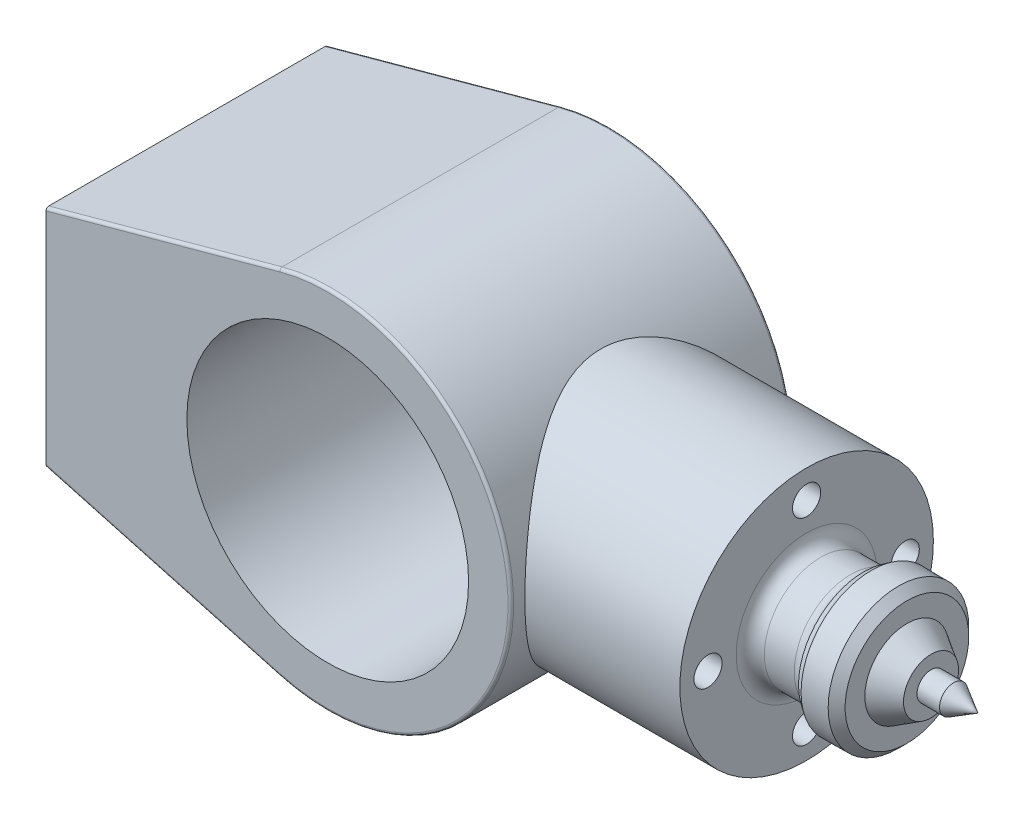
ISO-10303-21;
HEADER;
FILE_DESCRIPTION(('STEP AP214'),'2;1');
FILE_NAME('part.step','',(''),(''),'','','');
FILE_SCHEMA(('AUTOMOTIVE_DESIGN { 1 0 10303 214 1 1 1 1 }'));
ENDSEC;
DATA;
#1=APPLICATION_CONTEXT('core data for automotive mechanical design processes');
#2=APPLICATION_PROTOCOL_DEFINITION('international standard','automotive_design',2000,#1);
#3=PRODUCT_CONTEXT('',#1,'mechanical');
#4=PRODUCT('Part','Part','',(#3));
#5=PRODUCT_RELATED_PRODUCT_CATEGORY('part','',(#4));
#6=PRODUCT_DEFINITION_FORMATION('','',#4);
#7=PRODUCT_DEFINITION_CONTEXT('part definition',#1,'design');
#8=PRODUCT_DEFINITION('design','',#6,#7);
#9=PRODUCT_DEFINITION_SHAPE('','',#8);
#10=(LENGTH_UNIT() NAMED_UNIT(*) SI_UNIT(.MILLI.,.METRE.));
#11=(NAMED_UNIT(*) PLANE_ANGLE_UNIT() SI_UNIT($,.RADIAN.));
#12=(NAMED_UNIT(*) SI_UNIT($,.STERADIAN.) SOLID_ANGLE_UNIT());
#13=UNCERTAINTY_MEASURE_WITH_UNIT(LENGTH_MEASURE(1.E-05),#10,'distance_accuracy_value','');
#14=(GEOMETRIC_REPRESENTATION_CONTEXT(3) GLOBAL_UNCERTAINTY_ASSIGNED_CONTEXT((#13)) GLOBAL_UNIT_ASSIGNED_CONTEXT((#10,
#11,#12)) REPRESENTATION_CONTEXT('',''));
#15=CARTESIAN_POINT('',(0.,0.,0.));
#16=DIRECTION('',(0.,0.,1.));
#17=DIRECTION('',(1.,0.,0.));
#18=AXIS2_PLACEMENT_3D('',#15,#16,#17);
#19=CARTESIAN_POINT('',(0.,0.,50.));
#20=DIRECTION('',(0.,0.,1.));
#21=DIRECTION('',(1.,0.,0.));
#22=AXIS2_PLACEMENT_3D('',#19,#20,#21);
#23=PLANE('',#22);
#24=DIRECTION('',(0.,-1.,0.));
#25=VECTOR('',#24,1.);
#26=CARTESIAN_POINT('',(-100.,40.,50.));
#27=LINE('',#26,#25);
#28=CARTESIAN_POINT('',(-100.,38.9631546288037,50.));
#29=VERTEX_POINT('',#28);
#30=CARTESIAN_POINT('',(-100.,-38.9631546288037,50.));
#31=VERTEX_POINT('',#30);
#32=EDGE_CURVE('E340',#29,#31,#27,.T.);
#33=ORIENTED_EDGE('',*,*,#32,.T.);
#34=DIRECTION('',(0.964463967125762,-0.264214413149695,0.));
#35=VECTOR('',#34,1.);
#36=CARTESIAN_POINT('',(-16.9097224415805,-61.7256938960487,50.));
#37=LINE('',#36,#35);
#38=CARTESIAN_POINT('',(-16.9097224415805,-61.7256938960488,50.));
#39=VERTEX_POINT('',#38);
#40=EDGE_CURVE('E294',#31,#39,#37,.T.);
#41=ORIENTED_EDGE('',*,*,#40,.T.);
#42=CARTESIAN_POINT('',(0.,0.,50.));
#43=DIRECTION('',(0.,0.,1.));
#44=DIRECTION('',(1.,0.,0.));
#45=AXIS2_PLACEMENT_3D('',#42,#43,#44);
#46=CIRCLE('',#45,64.);
#47=CARTESIAN_POINT('',(-16.9097224415805,61.7256938960487,50.));
#48=VERTEX_POINT('',#47);
#49=EDGE_CURVE('E56',#39,#48,#46,.T.);
#50=ORIENTED_EDGE('',*,*,#49,.T.);
#51=DIRECTION('',(-0.964463967125762,-0.264214413149695,0.));
#52=VECTOR('',#51,1.);
#53=CARTESIAN_POINT('',(-99.7357855868503,39.0355360328742,50.));
#54=LINE('',#53,#52);
#55=EDGE_CURVE('E297',#48,#29,#54,.T.);
#56=ORIENTED_EDGE('',*,*,#55,.T.);
#57=EDGE_LOOP('',(#33,#41,#50,#56));
#58=FACE_BOUND('',#57,.T.);
#59=CARTESIAN_POINT('',(0.,0.,50.));
#60=DIRECTION('',(0.,0.,1.));
#61=DIRECTION('',(1.,0.,0.));
#62=AXIS2_PLACEMENT_3D('',#59,#60,#61);
#63=CIRCLE('',#62,50.);
#64=CARTESIAN_POINT('',(50.,0.,50.));
#65=VERTEX_POINT('',#64);
#66=EDGE_CURVE('E131',#65,#65,#63,.T.);
#67=ORIENTED_EDGE('',*,*,#66,.F.);
#68=EDGE_LOOP('',(#67));
#69=FACE_BOUND('',#68,.T.);
#70=ADVANCED_FACE('F34',(#58,#69),#23,.T.);
#71=CARTESIAN_POINT('',(0.,0.,-50.));
#72=DIRECTION('',(0.,0.,1.));
#73=DIRECTION('',(1.,0.,0.));
#74=AXIS2_PLACEMENT_3D('',#71,#72,#73);
#75=PLANE('',#74);
#76=CARTESIAN_POINT('',(0.,0.,-50.));
#77=DIRECTION('',(0.,0.,1.));
#78=DIRECTION('',(1.,0.,0.));
#79=AXIS2_PLACEMENT_3D('',#76,#77,#78);
#80=CIRCLE('',#79,64.);
#81=CARTESIAN_POINT('',(-16.9097224415805,61.7256938960487,-50.));
#82=VERTEX_POINT('',#81);
#83=CARTESIAN_POINT('',(-16.9097224415805,-61.7256938960488,-50.));
#84=VERTEX_POINT('',#83);
#85=EDGE_CURVE('E313',#82,#84,#80,.F.);
#86=ORIENTED_EDGE('',*,*,#85,.T.);
#87=DIRECTION('',(0.964463967125762,-0.264214413149695,0.));
#88=VECTOR('',#87,1.);
#89=CARTESIAN_POINT('',(-16.9097224415805,-61.7256938960487,-50.));
#90=LINE('',#89,#88);
#91=CARTESIAN_POINT('',(-100.,-38.9631546288037,-50.));
#92=VERTEX_POINT('',#91);
#93=EDGE_CURVE('E311',#84,#92,#90,.F.);
#94=ORIENTED_EDGE('',*,*,#93,.T.);
#95=DIRECTION('',(0.,-1.,0.));
#96=VECTOR('',#95,1.);
#97=CARTESIAN_POINT('',(-100.,40.,-50.));
#98=LINE('',#97,#96);
#99=CARTESIAN_POINT('',(-100.,38.9631546288037,-50.));
#100=VERTEX_POINT('',#99);
#101=EDGE_CURVE('E341',#100,#92,#98,.T.);
#102=ORIENTED_EDGE('',*,*,#101,.F.);
#103=DIRECTION('',(-0.964463967125762,-0.264214413149695,0.));
#104=VECTOR('',#103,1.);
#105=CARTESIAN_POINT('',(-16.9097224415805,61.7256938960487,-50.));
#106=LINE('',#105,#104);
#107=EDGE_CURVE('E315',#100,#82,#106,.F.);
#108=ORIENTED_EDGE('',*,*,#107,.T.);
#109=EDGE_LOOP('',(#86,#94,#102,#108));
#110=FACE_BOUND('',#109,.T.);
#111=CARTESIAN_POINT('',(0.,0.,-50.));
#112=DIRECTION('',(0.,0.,1.));
#113=DIRECTION('',(1.,0.,0.));
#114=AXIS2_PLACEMENT_3D('',#111,#112,#113);
#115=CIRCLE('',#114,50.);
#116=CARTESIAN_POINT('',(50.,0.,-50.));
#117=VERTEX_POINT('',#116);
#118=EDGE_CURVE('E124',#117,#117,#115,.T.);
#119=ORIENTED_EDGE('',*,*,#118,.T.);
#120=EDGE_LOOP('',(#119));
#121=FACE_BOUND('',#120,.T.);
#122=ADVANCED_FACE('F201',(#110,#121),#75,.F.);
#123=CARTESIAN_POINT('',(0.,0.,50.));
#124=DIRECTION('',(0.,0.,-1.));
#125=DIRECTION('',(-1.,0.,0.));
#126=AXIS2_PLACEMENT_3D('',#123,#124,#125);
#127=CYLINDRICAL_SURFACE('',#126,65.);
#128=CARTESIAN_POINT('',(65.,0.,-45.));
#129=CARTESIAN_POINT('',(65.0000011696057,1.12147330120565,-45.0000012025283));
#130=CARTESIAN_POINT('',(64.9709159765212,2.24292945230778,-44.9580201602482));
#131=CARTESIAN_POINT('',(64.8553068641383,4.47658414079082,-44.790785609369));
#132=CARTESIAN_POINT('',(64.7687842573088,5.58878288911931,-44.6655340035371));
#133=CARTESIAN_POINT('',(64.5403785763001,7.79555151848628,-44.3336771879691));
#134=CARTESIAN_POINT('',(64.3984760503456,8.89011506447751,-44.1270433931238));
#135=CARTESIAN_POINT('',(64.0626457436966,11.0533096019768,-43.6354760134034));
#136=CARTESIAN_POINT('',(63.8687169569864,12.1219400915896,-43.3505409144375));
#137=CARTESIAN_POINT('',(63.4342222744662,14.2212125160505,-42.7078017297046));
#138=CARTESIAN_POINT('',(63.1938918545645,15.2520162370063,-42.3503651251477));
#139=CARTESIAN_POINT('',(62.6709259446924,17.2756280115286,-41.5659763086892));
#140=CARTESIAN_POINT('',(62.3882907364915,18.268436318107,-41.1390245597888));
#141=CARTESIAN_POINT('',(61.786108553932,20.2116697228795,-40.2199419970838));
#142=CARTESIAN_POINT('',(61.4665619062631,21.1620951960855,-39.7278117601444));
#143=CARTESIAN_POINT('',(60.7962171584065,23.0172309124314,-38.6825647509799));
#144=CARTESIAN_POINT('',(60.4454175300334,23.9219389167185,-38.1294449962195));
#145=CARTESIAN_POINT('',(59.6865648974474,25.7601880140228,-36.9151737617935));
#146=CARTESIAN_POINT('',(59.27618815402,26.6893215363404,-36.2488040005491));
#147=CARTESIAN_POINT('',(58.4330275057249,28.4880338622967,-34.8529502059224));
#148=CARTESIAN_POINT('',(58.0002425478181,29.3576098626539,-34.1234632053608));
#149=CARTESIAN_POINT('',(57.1195111836477,31.0364486388513,-32.6040251352403));
#150=CARTESIAN_POINT('',(56.6715447181891,31.8456267033451,-31.8139921794123));
#151=CARTESIAN_POINT('',(55.7691986061138,33.4006700551814,-30.1773036556993));
#152=CARTESIAN_POINT('',(55.3148185876119,34.1465316534289,-29.3306447936721));
#153=CARTESIAN_POINT('',(54.3303114345595,35.6959084068904,-27.4326466159468));
#154=CARTESIAN_POINT('',(53.8005937511269,36.4872853280241,-26.3711450656527));
#155=CARTESIAN_POINT('',(52.7593327891933,37.9773509509911,-24.17604025639));
#156=CARTESIAN_POINT('',(52.2477941160227,38.6760162868262,-23.0424189272517));
#157=CARTESIAN_POINT('',(51.2608149265043,39.9749077721744,-20.7072341856928));
#158=CARTESIAN_POINT('',(50.7853275075273,40.5752630453964,-19.5057627267967));
#159=CARTESIAN_POINT('',(49.8892399163793,41.6721166930025,-17.036931864064));
#160=CARTESIAN_POINT('',(49.4686114171658,42.1686687478853,-15.7696069409943));
#161=CARTESIAN_POINT('',(48.8208029416879,42.9149535309565,-13.5723996352816));
#162=CARTESIAN_POINT('',(48.5738420263557,43.1936925213245,-12.6581208440976));
#163=CARTESIAN_POINT('',(48.1238801744123,43.6944569649788,-10.8035389223551));
#164=CARTESIAN_POINT('',(47.9208721021929,43.9164916250901,-9.86324004407419));
#165=CARTESIAN_POINT('',(47.5660754926548,44.3005296261305,-7.96250438663409));
#166=CARTESIAN_POINT('',(47.4142038087044,44.4626304606427,-7.00210302149487));
#167=CARTESIAN_POINT('',(47.1671263845177,44.7246555122386,-5.06554052628518));
#168=CARTESIAN_POINT('',(47.0719206259529,44.824579749433,-4.08937940131224));
#169=CARTESIAN_POINT('',(46.9418899090943,44.9607388198673,-2.1232364847967));
#170=CARTESIAN_POINT('',(46.9073939345417,44.9966266570423,-1.13320851844658));
#171=CARTESIAN_POINT('',(46.9013571135476,45.0029190462422,0.847248377093852));
#172=CARTESIAN_POINT('',(46.9298161498631,44.9733237202183,1.837677305534));
#173=CARTESIAN_POINT('',(47.0484302849821,44.8492190899201,3.81128752429081));
#174=CARTESIAN_POINT('',(47.13862305521,44.7546701492421,4.79446401850661));
#175=CARTESIAN_POINT('',(47.3768313176079,44.5024241630868,6.74551496467455));
#176=CARTESIAN_POINT('',(47.5248480621437,44.3447257499009,7.71338908473168));
#177=CARTESIAN_POINT('',(47.8621764271841,43.9803320764262,9.56919366964684));
#178=CARTESIAN_POINT('',(48.0484149088864,43.7772163066585,10.4583970625519));
#179=CARTESIAN_POINT('',(48.4609441046406,43.32010640119,12.2144143492181));
#180=CARTESIAN_POINT('',(48.6872496045115,43.0660934784815,13.0812198417583));
#181=CARTESIAN_POINT('',(49.1738509640383,42.5096331932465,14.7898225666927));
#182=CARTESIAN_POINT('',(49.4341648638834,42.2071601049958,15.6316062329481));
#183=CARTESIAN_POINT('',(49.9825182796335,41.5563350032134,17.2876417419013));
#184=CARTESIAN_POINT('',(50.2705534011697,41.2079902580444,18.1018979206949));
#185=CARTESIAN_POINT('',(51.0225431471345,40.2767822129268,20.1137766396802));
#186=CARTESIAN_POINT('',(51.5007434523328,39.6654891440572,21.2930273345177));
#187=CARTESIAN_POINT('',(52.4891158781477,38.348029920852,23.5833678403921));
#188=CARTESIAN_POINT('',(52.9993005340589,37.6418264436726,24.6944305853524));
#189=CARTESIAN_POINT('',(54.0361557973494,36.1376496350166,26.8476775780095));
#190=CARTESIAN_POINT('',(54.5628535785461,35.3395185623559,27.8897384505711));
#191=CARTESIAN_POINT('',(55.6171804467178,33.6558443419671,29.8998791095632));
#192=CARTESIAN_POINT('',(56.1448094104418,32.7703120184234,30.8679680307498));
#193=CARTESIAN_POINT('',(57.1932449701135,30.9045304086319,32.7363921475659));
#194=CARTESIAN_POINT('',(57.7139191350983,29.9233731295192,33.6358963165067));
#195=CARTESIAN_POINT('',(58.7296419536465,27.8771206485979,35.350355349792));
#196=CARTESIAN_POINT('',(59.2246882700661,26.8120178135979,36.1653025097018));
#197=CARTESIAN_POINT('',(60.1756566955639,24.6035209522421,37.7024332048813));
#198=CARTESIAN_POINT('',(60.6316475651595,23.4602711709794,38.4247809320632));
#199=CARTESIAN_POINT('',(61.4931891608211,21.0989507187335,39.7703323765769));
#200=CARTESIAN_POINT('',(61.898755017873,19.8809026570889,40.3935658507715));
#201=CARTESIAN_POINT('',(62.5646802947783,17.6549035875762,41.4059204565395));
#202=CARTESIAN_POINT('',(62.8372982548467,16.6602403417733,41.8163120535009));
#203=CARTESIAN_POINT('',(63.3397164077328,14.6345031625144,42.5675669112335));
#204=CARTESIAN_POINT('',(63.569522535998,13.603434299959,42.9084398107234));
#205=CARTESIAN_POINT('',(63.9815049902596,11.5110112910016,43.5164676119118));
#206=CARTESIAN_POINT('',(64.1637052650743,10.4496726714621,43.7836595836378));
#207=CARTESIAN_POINT('',(64.476639865795,8.30296993183371,44.2409869387356));
#208=CARTESIAN_POINT('',(64.6073730982257,7.21760530180254,44.431120684921));
#209=CARTESIAN_POINT('',(64.8147345736682,5.02649787175023,44.7321113931983));
#210=CARTESIAN_POINT('',(64.8911534961694,3.92069290489763,44.8426616714377));
#211=CARTESIAN_POINT('',(64.9872183357685,1.70145350776208,44.981563734156));
#212=CARTESIAN_POINT('',(65.0068642771874,0.588019080747696,45.0099155538474));
#213=CARTESIAN_POINT('',(64.9889001241945,-1.63741781931566,44.9839662509349));
#214=CARTESIAN_POINT('',(64.9512898349751,-2.74942028747967,44.929664847113));
#215=CARTESIAN_POINT('',(64.819734418053,-4.96298947367603,44.7392747901952));
#216=CARTESIAN_POINT('',(64.7257910494465,-6.06455651648127,44.6031886909653));
#217=CARTESIAN_POINT('',(64.491175703309,-8.18254449212149,44.2620157992034));
#218=CARTESIAN_POINT('',(64.3536808680178,-9.20007959997774,44.0616107864454));
#219=CARTESIAN_POINT('',(64.0337856060908,-11.2121337136589,43.5930613516679));
#220=CARTESIAN_POINT('',(63.8513873855499,-12.2066538475799,43.3249202574929));
#221=CARTESIAN_POINT('',(63.4451725249075,-14.1673074608523,42.7239854011605));
#222=CARTESIAN_POINT('',(63.2213525684632,-15.1334386601223,42.3911864622047));
#223=CARTESIAN_POINT('',(62.736336352677,-17.0327019487273,41.6643868113868));
#224=CARTESIAN_POINT('',(62.4751380044848,-17.965832190203,41.2703826790343));
#225=CARTESIAN_POINT('',(61.8990085085122,-19.8637431772395,40.3931275129008));
#226=CARTESIAN_POINT('',(61.5815209528501,-20.8256806929253,39.9054081529014));
#227=CARTESIAN_POINT('',(60.9142086391395,-22.7035764997345,38.8677076181211));
#228=CARTESIAN_POINT('',(60.5643826081083,-23.6195329786528,38.3177239921568));
#229=CARTESIAN_POINT('',(59.8381347129401,-25.4032558353403,37.1592008079418));
#230=CARTESIAN_POINT('',(59.4616987975441,-26.270996314329,36.5506302507532));
#231=CARTESIAN_POINT('',(58.6884577670336,-27.9557544991496,35.2787474176625));
#232=CARTESIAN_POINT('',(58.2916515549571,-28.7727694681138,34.6154321925309));
#233=CARTESIAN_POINT('',(57.4151711853793,-30.4889708749912,33.1199200847161));
#234=CARTESIAN_POINT('',(56.9328754552547,-31.3785212006928,32.2781812569548));
#235=CARTESIAN_POINT('',(55.9590893109094,-33.0839042215169,30.5278352445589));
#236=CARTESIAN_POINT('',(55.4675975421249,-33.8997259516808,29.6192181500899));
#237=CARTESIAN_POINT('',(54.4860350387397,-35.45586994741,27.7375714933993));
#238=CARTESIAN_POINT('',(53.9959654596117,-36.1961418986443,26.7644997080007));
#239=CARTESIAN_POINT('',(53.0294834997435,-37.5978502361011,24.7568233036382));
#240=CARTESIAN_POINT('',(52.553069328415,-38.2592969946585,23.7222268074148));
#241=CARTESIAN_POINT('',(51.679941347726,-39.4291013564639,21.7149007388747));
#242=CARTESIAN_POINT('',(51.2803372484816,-39.9463152685162,20.7485884228094));
#243=CARTESIAN_POINT('',(50.5123974548912,-40.9130636661729,18.7705314851885));
#244=CARTESIAN_POINT('',(50.1440619804653,-41.3625976757848,17.7587865441704));
#245=CARTESIAN_POINT('',(49.4504928922364,-42.1893301292689,15.693797265063));
#246=CARTESIAN_POINT('',(49.1251906412473,-42.566644202947,14.6406225749502));
#247=CARTESIAN_POINT('',(48.5290098021012,-43.2451098617227,12.4950157035289));
#248=CARTESIAN_POINT('',(48.2581179989952,-43.5462799449171,11.4025931307277));
#249=CARTESIAN_POINT('',(47.8271610412375,-44.0186874861181,9.3921629994351));
#250=CARTESIAN_POINT('',(47.6558419905218,-44.2036946073207,8.47979353570419));
#251=CARTESIAN_POINT('',(47.3627606953031,-44.517583244497,6.63757582668245));
#252=CARTESIAN_POINT('',(47.2409923142224,-44.6464717105955,5.70772976070373));
#253=CARTESIAN_POINT('',(47.05166615705,-44.8459556683364,3.83718735816971));
#254=CARTESIAN_POINT('',(46.9840561376509,-44.9166073394187,2.89650236820514));
#255=CARTESIAN_POINT('',(46.9055698265682,-44.9985645522097,1.01014116515035));
#256=CARTESIAN_POINT('',(46.894694331428,-45.0098692606967,0.0644648821697862));
#257=CARTESIAN_POINT('',(46.9301408777119,-44.972908524549,-1.82506201386804));
#258=CARTESIAN_POINT('',(46.9764888551696,-44.9246160680299,-2.76891160474201));
#259=CARTESIAN_POINT('',(47.1245232303033,-44.7693052695385,-4.64731891289862));
#260=CARTESIAN_POINT('',(47.226209296244,-44.6622872796082,-5.58187668584874));
#261=CARTESIAN_POINT('',(47.4811423262629,-44.3911660407895,-7.43666598606561));
#262=CARTESIAN_POINT('',(47.634452919394,-44.2269923369625,-8.35687836049678));
#263=CARTESIAN_POINT('',(47.9871889035597,-43.8440109221367,-10.1768310643423));
#264=CARTESIAN_POINT('',(48.1866204648689,-43.6251959006593,-11.0765686368372));
#265=CARTESIAN_POINT('',(48.6908782922366,-43.0625185245671,-13.116726178063));
#266=CARTESIAN_POINT('',(49.0093972350599,-42.7008255731353,-14.2488681052183));
#267=CARTESIAN_POINT('',(49.699554494161,-41.8955268796886,-16.4668795226373));
#268=CARTESIAN_POINT('',(50.0712093704162,-41.4518955887103,-17.5527344499461));
#269=CARTESIAN_POINT('',(50.8544123719762,-40.4872212981013,-19.6760329984318));
#270=CARTESIAN_POINT('',(51.2660067549033,-39.9660881554129,-20.7134183727638));
#271=CARTESIAN_POINT('',(52.116211879306,-38.8508952329155,-22.7363587217865));
#272=CARTESIAN_POINT('',(52.5548209260535,-38.2568400254561,-23.7219169406072));
#273=CARTESIAN_POINT('',(53.4579357785502,-36.9847423381263,-25.6613286822633));
#274=CARTESIAN_POINT('',(53.9228021101371,-36.3051118639051,-26.6139712103077));
#275=CARTESIAN_POINT('',(54.8583333343946,-34.8753950985048,-28.4617532840731));
#276=CARTESIAN_POINT('',(55.3289982185488,-34.1253089107936,-29.3568929142368));
#277=CARTESIAN_POINT('',(56.2664339133503,-32.5564691651912,-31.0876310121466));
#278=CARTESIAN_POINT('',(56.7332035093429,-31.7376950080829,-31.923211478402));
#279=CARTESIAN_POINT('',(57.6535165855435,-30.033481652025,-33.5315189390535));
#280=CARTESIAN_POINT('',(58.1070588196762,-29.1480362003111,-34.3042400240121));
#281=CARTESIAN_POINT('',(59.0635284336244,-27.1643113596245,-35.9022819462667));
#282=CARTESIAN_POINT('',(59.5626106290919,-26.0547472869609,-36.7159606163356));
#283=CARTESIAN_POINT('',(60.5176757229357,-23.7521280348398,-38.2458641369291));
#284=CARTESIAN_POINT('',(60.9736519283074,-22.5590599397198,-38.962073861155));
#285=CARTESIAN_POINT('',(61.6149926579414,-20.7127348127311,-39.9558623322098));
#286=CARTESIAN_POINT('',(61.8215919655179,-20.088110583999,-40.2735888165198));
#287=CARTESIAN_POINT('',(62.2191547005856,-18.8206694867556,-40.8812436548858));
#288=CARTESIAN_POINT('',(62.4101203779565,-18.1778552539997,-41.1711760099034));
#289=CARTESIAN_POINT('',(62.7748527233683,-16.875283117665,-41.7219931318356));
#290=CARTESIAN_POINT('',(62.9486230408552,-16.2155288469421,-41.9828840638124));
#291=CARTESIAN_POINT('',(63.2775356475737,-14.8804011558233,-42.4744610119283));
#292=CARTESIAN_POINT('',(63.432679284421,-14.2050288695917,-42.7051492133046));
#293=CARTESIAN_POINT('',(63.8070721968101,-12.4447010544915,-43.25974494481));
#294=CARTESIAN_POINT('',(64.0114184468014,-11.3490405228654,-43.5602757498286));
#295=CARTESIAN_POINT('',(64.3654191982087,-9.12991345978806,-44.078827644396));
#296=CARTESIAN_POINT('',(64.5150820049425,-8.00645117856259,-44.2968612637911));
#297=CARTESIAN_POINT('',(64.7559993187061,-5.74082253729113,-44.6470112993716));
#298=CARTESIAN_POINT('',(64.847297757104,-4.59867091062173,-44.7791923387443));
#299=CARTESIAN_POINT('',(64.9692976296881,-2.30434018473195,-44.9556862638234));
#300=CARTESIAN_POINT('',(64.9999987983895,-1.15216104160189,-44.999998764566));
#301=CARTESIAN_POINT('',(65.,0.,-45.));
#302=B_SPLINE_CURVE_WITH_KNOTS('',3,(#128,#129,#130,#131,#132,#133,#134,#135,#136,#137,#138,
#139,#140,#141,#142,#143,#144,#145,#146,#147,#148,#149,#150,#151,#152,#153,#154,#155,#156,#157,
#158,#159,#160,#161,#162,#163,#164,#165,#166,#167,#168,#169,#170,#171,#172,#173,#174,#175,#176,
#177,#178,#179,#180,#181,#182,#183,#184,#185,#186,#187,#188,#189,#190,#191,#192,#193,#194,#195,
#196,#197,#198,#199,#200,#201,#202,#203,#204,#205,#206,#207,#208,#209,#210,#211,#212,#213,#214,
#215,#216,#217,#218,#219,#220,#221,#222,#223,#224,#225,#226,#227,#228,#229,#230,#231,#232,#233,
#234,#235,#236,#237,#238,#239,#240,#241,#242,#243,#244,#245,#246,#247,#248,#249,#250,#251,#252,
#253,#254,#255,#256,#257,#258,#259,#260,#261,#262,#263,#264,#265,#266,#267,#268,#269,#270,#271,
#272,#273,#274,#275,#276,#277,#278,#279,#280,#281,#282,#283,#284,#285,#286,#287,#288,#289,#290,
#291,#292,#293,#294,#295,#296,#297,#298,#299,#300,#301),.UNSPECIFIED.,.T.,.F.,(4,2,2,2,2,2,2,2,
2,2,2,2,2,2,2,2,2,2,2,2,2,2,2,2,2,2,2,2,2,2,2,2,2,2,2,2,2,2,2,2,2,2,2,2,2,2,2,2,2,2,2,2,2,2,2,2,
2,2,2,2,2,2,2,2,2,2,2,2,2,2,2,2,2,2,2,2,2,2,2,2,2,2,2,2,2,2,4),(0.,3.36323892794144,
6.72640100710137,10.0907454360665,13.4551549250109,16.8029195613731,20.1506619010729,
23.4983746134034,26.8462511096753,30.4871649037346,34.1282499524345,37.7743494260164,
41.4206611917409,45.6939383064405,49.9682903731881,54.2369825353392,58.5034617073671,
61.4625138492405,64.4210852373372,67.3748225577202,70.3285589227263,73.2982527376573,
76.2679410220407,79.2394430998938,82.2110095388412,85.0011411726389,87.7923045951578,
90.584954683776,93.3771628083065,97.6064034875675,101.837312178738,106.075592113262,
110.313347816192,114.596218662803,118.879479402292,123.155037051935,127.429308626693,
130.755998382163,134.082226580387,137.406778235214,140.731400520075,144.068767009318,
147.406132068879,150.743508483461,154.080780688207,157.215791533369,160.350648386749,
163.485756334407,166.621039552604,169.990545063149,173.360183268584,176.73161428665,
180.103227050672,184.047902440152,187.993163521895,191.94103513809,195.888386692538,
199.385185586645,202.88200907258,206.373186157811,209.863514294626,212.700365177753,
215.536864625513,218.370624567028,221.204424293963,224.039508887241,226.874576485218,
229.713151272815,232.55210603787,236.23803941247,239.925124033801,243.616531168718,
247.307706963636,251.081871120678,254.856029735252,258.631324277359,262.406973327354,
266.792058434818,271.177823293658,273.368885604935,275.55963203795,277.749912517597,
279.940034437727,283.398420446896,286.856280978073,290.31153567335,293.766805506531),.UNSPECIFIED.);
#303=CARTESIAN_POINT('',(65.,0.,-45.));
#304=VERTEX_POINT('',#303);
#305=EDGE_CURVE('E112',#304,#304,#302,.T.);
#306=ORIENTED_EDGE('',*,*,#305,.F.);
#307=EDGE_LOOP('',(#306));
#308=FACE_BOUND('',#307,.T.);
#309=DIRECTION('',(0.,0.,-1.));
#310=VECTOR('',#309,1.);
#311=CARTESIAN_POINT('',(-17.1739368547302,-62.6901578631745,50.));
#312=LINE('',#311,#310);
#313=CARTESIAN_POINT('',(-17.1739368547302,-62.6901578631745,49.));
#314=VERTEX_POINT('',#313);
#315=CARTESIAN_POINT('',(-17.1739368547302,-62.6901578631745,-49.));
#316=VERTEX_POINT('',#315);
#317=EDGE_CURVE('E337',#314,#316,#312,.T.);
#318=ORIENTED_EDGE('',*,*,#317,.T.);
#319=CARTESIAN_POINT('',(0.,0.,-49.));
#320=DIRECTION('',(0.,0.,1.));
#321=DIRECTION('',(1.,0.,0.));
#322=AXIS2_PLACEMENT_3D('',#319,#320,#321);
#323=CIRCLE('',#322,65.);
#324=CARTESIAN_POINT('',(-17.1739368547302,62.6901578631745,-49.));
#325=VERTEX_POINT('',#324);
#326=EDGE_CURVE('E299',#316,#325,#323,.T.);
#327=ORIENTED_EDGE('',*,*,#326,.T.);
#328=DIRECTION('',(0.,0.,-1.));
#329=VECTOR('',#328,1.);
#330=CARTESIAN_POINT('',(-17.1739368547302,62.6901578631745,50.));
#331=LINE('',#330,#329);
#332=CARTESIAN_POINT('',(-17.1739368547302,62.6901578631745,49.));
#333=VERTEX_POINT('',#332);
#334=EDGE_CURVE('E328',#333,#325,#331,.T.);
#335=ORIENTED_EDGE('',*,*,#334,.F.);
#336=CARTESIAN_POINT('',(0.,0.,49.));
#337=DIRECTION('',(0.,0.,1.));
#338=DIRECTION('',(1.,0.,0.));
#339=AXIS2_PLACEMENT_3D('',#336,#337,#338);
#340=CIRCLE('',#339,65.);
#341=EDGE_CURVE('E301',#333,#314,#340,.F.);
#342=ORIENTED_EDGE('',*,*,#341,.T.);
#343=EDGE_LOOP('',(#318,#327,#335,#342));
#344=FACE_BOUND('',#343,.T.);
#345=ADVANCED_FACE('F206',(#308,#344),#127,.T.);
#346=CARTESIAN_POINT('',(-17.1739368547302,62.6901578631745,50.));
#347=DIRECTION('',(0.264214413149695,-0.964463967125762,0.));
#348=DIRECTION('',(0.964463967125762,0.264214413149695,0.));
#349=AXIS2_PLACEMENT_3D('',#346,#347,#348);
#350=PLANE('',#349);
#351=ORIENTED_EDGE('',*,*,#334,.T.);
#352=DIRECTION('',(-0.964463967125762,-0.264214413149695,0.));
#353=VECTOR('',#352,1.);
#354=CARTESIAN_POINT('',(-17.1739368547302,62.6901578631745,-49.));
#355=LINE('',#354,#353);
#356=CARTESIAN_POINT('',(-100.,40.,-49.));
#357=VERTEX_POINT('',#356);
#358=EDGE_CURVE('E275',#325,#357,#355,.T.);
#359=ORIENTED_EDGE('',*,*,#358,.T.);
#360=DIRECTION('',(0.,0.,-1.));
#361=VECTOR('',#360,1.);
#362=CARTESIAN_POINT('',(-100.,40.,50.));
#363=LINE('',#362,#361);
#364=CARTESIAN_POINT('',(-100.,40.,49.));
#365=VERTEX_POINT('',#364);
#366=EDGE_CURVE('E331',#365,#357,#363,.T.);
#367=ORIENTED_EDGE('',*,*,#366,.F.);
#368=DIRECTION('',(-0.964463967125762,-0.264214413149695,0.));
#369=VECTOR('',#368,1.);
#370=CARTESIAN_POINT('',(-17.1739368547302,62.6901578631745,49.));
#371=LINE('',#370,#369);
#372=EDGE_CURVE('E292',#365,#333,#371,.F.);
#373=ORIENTED_EDGE('',*,*,#372,.T.);
#374=EDGE_LOOP('',(#351,#359,#367,#373));
#375=FACE_BOUND('',#374,.T.);
#376=ADVANCED_FACE('F219',(#375),#350,.F.);
#377=CARTESIAN_POINT('',(-100.,40.,50.));
#378=DIRECTION('',(1.,0.,0.));
#379=DIRECTION('',(0.,0.,-1.));
#380=AXIS2_PLACEMENT_3D('',#377,#378,#379);
#381=PLANE('',#380);
#382=ORIENTED_EDGE('',*,*,#101,.T.);
#383=CARTESIAN_POINT('',(-100.,-38.9631546288037,-49.));
#384=DIRECTION('',(1.,0.,0.));
#385=DIRECTION('',(0.,-1.,0.));
#386=AXIS2_PLACEMENT_3D('',#383,#384,#385);
#387=ELLIPSE('',#386,1.03684537119633,1.);
#388=CARTESIAN_POINT('',(-100.,-40.,-49.));
#389=VERTEX_POINT('',#388);
#390=EDGE_CURVE('E303',#92,#389,#387,.F.);
#391=ORIENTED_EDGE('',*,*,#390,.T.);
#392=DIRECTION('',(0.,0.,-1.));
#393=VECTOR('',#392,1.);
#394=CARTESIAN_POINT('',(-100.,-40.,50.));
#395=LINE('',#394,#393);
#396=CARTESIAN_POINT('',(-100.,-40.,49.));
#397=VERTEX_POINT('',#396);
#398=EDGE_CURVE('E334',#397,#389,#395,.T.);
#399=ORIENTED_EDGE('',*,*,#398,.F.);
#400=CARTESIAN_POINT('',(-100.,-38.9631546288037,49.));
#401=DIRECTION('',(1.,0.,0.));
#402=DIRECTION('',(0.,1.,0.));
#403=AXIS2_PLACEMENT_3D('',#400,#401,#402);
#404=ELLIPSE('',#403,1.03684537119633,1.);
#405=EDGE_CURVE('E305',#397,#31,#404,.F.);
#406=ORIENTED_EDGE('',*,*,#405,.T.);
#407=ORIENTED_EDGE('',*,*,#32,.F.);
#408=CARTESIAN_POINT('',(-100.,38.9631546288037,49.));
#409=DIRECTION('',(1.,0.,0.));
#410=DIRECTION('',(0.,1.,0.));
#411=AXIS2_PLACEMENT_3D('',#408,#409,#410);
#412=ELLIPSE('',#411,1.03684537119633,1.);
#413=EDGE_CURVE('E309',#29,#365,#412,.F.);
#414=ORIENTED_EDGE('',*,*,#413,.T.);
#415=ORIENTED_EDGE('',*,*,#366,.T.);
#416=CARTESIAN_POINT('',(-100.,38.9631546288037,-49.));
#417=DIRECTION('',(1.,0.,0.));
#418=DIRECTION('',(0.,-1.,0.));
#419=AXIS2_PLACEMENT_3D('',#416,#417,#418);
#420=ELLIPSE('',#419,1.03684537119633,1.);
#421=EDGE_CURVE('E307',#357,#100,#420,.F.);
#422=ORIENTED_EDGE('',*,*,#421,.T.);
#423=EDGE_LOOP('',(#382,#391,#399,#406,#407,#414,#415,#422));
#424=FACE_BOUND('',#423,.T.);
#425=ADVANCED_FACE('F215',(#424),#381,.F.);
#426=CARTESIAN_POINT('',(-17.1739368547302,-62.6901578631745,50.));
#427=DIRECTION('',(0.264214413149695,0.964463967125762,0.));
#428=DIRECTION('',(-0.964463967125762,0.264214413149695,0.));
#429=AXIS2_PLACEMENT_3D('',#426,#427,#428);
#430=PLANE('',#429);
#431=ORIENTED_EDGE('',*,*,#398,.T.);
#432=DIRECTION('',(0.964463967125762,-0.264214413149695,0.));
#433=VECTOR('',#432,1.);
#434=CARTESIAN_POINT('',(-17.1739368547302,-62.6901578631745,-49.));
#435=LINE('',#434,#433);
#436=EDGE_CURVE('E317',#389,#316,#435,.T.);
#437=ORIENTED_EDGE('',*,*,#436,.T.);
#438=ORIENTED_EDGE('',*,*,#317,.F.);
#439=DIRECTION('',(0.964463967125762,-0.264214413149695,0.));
#440=VECTOR('',#439,1.);
#441=CARTESIAN_POINT('',(-100.,-40.,49.));
#442=LINE('',#441,#440);
#443=EDGE_CURVE('E320',#314,#397,#442,.F.);
#444=ORIENTED_EDGE('',*,*,#443,.T.);
#445=EDGE_LOOP('',(#431,#437,#438,#444));
#446=FACE_BOUND('',#445,.T.);
#447=ADVANCED_FACE('F212',(#446),#430,.F.);
#448=CARTESIAN_POINT('',(0.,0.,50.));
#449=DIRECTION('',(0.,0.,-1.));
#450=DIRECTION('',(-1.,0.,0.));
#451=AXIS2_PLACEMENT_3D('',#448,#449,#450);
#452=CYLINDRICAL_SURFACE('',#451,50.);
#453=ORIENTED_EDGE('',*,*,#66,.T.);
#454=EDGE_LOOP('',(#453));
#455=FACE_BOUND('',#454,.T.);
#456=ORIENTED_EDGE('',*,*,#118,.F.);
#457=EDGE_LOOP('',(#456));
#458=FACE_BOUND('',#457,.T.);
#459=ADVANCED_FACE('F139',(#455,#458),#452,.F.);
#460=CARTESIAN_POINT('',(120.,0.,0.));
#461=DIRECTION('',(1.,0.,0.));
#462=DIRECTION('',(0.,0.,-1.));
#463=AXIS2_PLACEMENT_3D('',#460,#461,#462);
#464=PLANE('',#463);
#465=CARTESIAN_POINT('',(120.,0.,0.));
#466=DIRECTION('',(1.,0.,0.));
#467=DIRECTION('',(0.,0.,-1.));
#468=AXIS2_PLACEMENT_3D('',#465,#466,#467);
#469=CIRCLE('',#468,25.);
#470=CARTESIAN_POINT('',(120.,0.,-25.));
#471=VERTEX_POINT('',#470);
#472=EDGE_CURVE('E322',#471,#471,#469,.F.);
#473=ORIENTED_EDGE('',*,*,#472,.T.);
#474=EDGE_LOOP('',(#473));
#475=FACE_BOUND('',#474,.T.);
#476=CARTESIAN_POINT('',(120.,-9.9475983006414E-13,34.999999999999));
#477=DIRECTION('',(1.,0.,0.));
#478=DIRECTION('',(0.,0.,-1.));
#479=AXIS2_PLACEMENT_3D('',#476,#477,#478);
#480=CIRCLE('',#479,5.00000000000159);
#481=CARTESIAN_POINT('',(120.,-9.9475983006414E-13,29.9999999999974));
#482=VERTEX_POINT('',#481);
#483=EDGE_CURVE('E620',#482,#482,#480,.T.);
#484=ORIENTED_EDGE('',*,*,#483,.F.);
#485=EDGE_LOOP('',(#484));
#486=FACE_BOUND('',#485,.T.);
#487=CARTESIAN_POINT('',(120.,9.90473566267125E-13,-35.000000000001));
#488=DIRECTION('',(1.,0.,0.));
#489=DIRECTION('',(0.,0.,-1.));
#490=AXIS2_PLACEMENT_3D('',#487,#488,#489);
#491=CIRCLE('',#490,5.00000000000077);
#492=CARTESIAN_POINT('',(120.,9.90473566267125E-13,-40.0000000000018));
#493=VERTEX_POINT('',#492);
#494=EDGE_CURVE('E624',#493,#493,#491,.T.);
#495=ORIENTED_EDGE('',*,*,#494,.F.);
#496=EDGE_LOOP('',(#495));
#497=FACE_BOUND('',#496,.T.);
#498=CARTESIAN_POINT('',(120.,-35.,-1.98094713253425E-12));
#499=DIRECTION('',(1.,0.,0.));
#500=DIRECTION('',(0.,0.,-1.));
#501=AXIS2_PLACEMENT_3D('',#498,#499,#500);
#502=CIRCLE('',#501,5.00000000000213);
#503=CARTESIAN_POINT('',(120.,-35.,-5.00000000000411));
#504=VERTEX_POINT('',#503);
#505=EDGE_CURVE('E628',#504,#504,#502,.T.);
#506=ORIENTED_EDGE('',*,*,#505,.F.);
#507=EDGE_LOOP('',(#506));
#508=FACE_BOUND('',#507,.T.);
#509=CARTESIAN_POINT('',(120.,35.,0.));
#510=DIRECTION('',(1.,0.,0.));
#511=DIRECTION('',(0.,0.,-1.));
#512=AXIS2_PLACEMENT_3D('',#509,#510,#511);
#513=CIRCLE('',#512,5.);
#514=CARTESIAN_POINT('',(120.,35.,-5.));
#515=VERTEX_POINT('',#514);
#516=EDGE_CURVE('E631',#515,#515,#513,.T.);
#517=ORIENTED_EDGE('',*,*,#516,.F.);
#518=EDGE_LOOP('',(#517));
#519=FACE_BOUND('',#518,.T.);
#520=CARTESIAN_POINT('',(120.,0.,0.));
#521=DIRECTION('',(1.,0.,0.));
#522=DIRECTION('',(0.,0.,-1.));
#523=AXIS2_PLACEMENT_3D('',#520,#521,#522);
#524=CIRCLE('',#523,45.);
#525=CARTESIAN_POINT('',(120.,0.,-45.));
#526=VERTEX_POINT('',#525);
#527=EDGE_CURVE('E116',#526,#526,#524,.T.);
#528=ORIENTED_EDGE('',*,*,#527,.T.);
#529=EDGE_LOOP('',(#528));
#530=FACE_BOUND('',#529,.T.);
#531=ADVANCED_FACE('F137',(#475,#486,#497,#508,#519,#530),#464,.T.);
#532=CARTESIAN_POINT('',(-500000.,0.,0.));
#533=DIRECTION('',(1.,0.,0.));
#534=DIRECTION('',(0.,0.,-1.));
#535=AXIS2_PLACEMENT_3D('',#532,#533,#534);
#536=CYLINDRICAL_SURFACE('',#535,45.);
#537=ORIENTED_EDGE('',*,*,#527,.F.);
#538=EDGE_LOOP('',(#537));
#539=FACE_BOUND('',#538,.T.);
#540=ORIENTED_EDGE('',*,*,#305,.T.);
#541=EDGE_LOOP('',(#540));
#542=FACE_BOUND('',#541,.T.);
#543=ADVANCED_FACE('F106',(#539,#542),#536,.T.);
#544=CARTESIAN_POINT('',(172.173985936526,0.,0.));
#545=DIRECTION('',(-1.,0.,0.));
#546=DIRECTION('',(0.,0.,1.));
#547=AXIS2_PLACEMENT_3D('',#544,#545,#546);
#548=CONICAL_SURFACE('',#547,4.99999999999997,0.523598775598287);
#549=CARTESIAN_POINT('',(180.83423997437,0.,0.));
#550=VERTEX_POINT('',#549);
#551=VERTEX_LOOP('',#550);
#552=FACE_BOUND('',#551,.T.);
#553=CARTESIAN_POINT('',(172.173985936526,0.,0.));
#554=DIRECTION('',(-1.,0.,0.));
#555=DIRECTION('',(0.,0.,1.));
#556=AXIS2_PLACEMENT_3D('',#553,#554,#555);
#557=CIRCLE('',#556,4.99999999999997);
#558=CARTESIAN_POINT('',(172.173985936526,0.,4.99999999999997));
#559=VERTEX_POINT('',#558);
#560=EDGE_CURVE('E110',#559,#559,#557,.T.);
#561=ORIENTED_EDGE('',*,*,#560,.F.);
#562=EDGE_LOOP('',(#561));
#563=FACE_BOUND('',#562,.T.);
#564=ADVANCED_FACE('F102',(#552,#563),#548,.T.);
#565=CARTESIAN_POINT('',(-1000.,0.,0.));
#566=DIRECTION('',(-1.,0.,0.));
#567=DIRECTION('',(0.,0.,1.));
#568=AXIS2_PLACEMENT_3D('',#565,#566,#567);
#569=CYLINDRICAL_SURFACE('',#568,4.99999999999997);
#570=ORIENTED_EDGE('',*,*,#560,.T.);
#571=EDGE_LOOP('',(#570));
#572=FACE_BOUND('',#571,.T.);
#573=CARTESIAN_POINT('',(164.173985936526,0.,0.));
#574=DIRECTION('',(-1.,0.,0.));
#575=DIRECTION('',(0.,0.,1.));
#576=AXIS2_PLACEMENT_3D('',#573,#574,#575);
#577=CIRCLE('',#576,4.99999999999997);
#578=CARTESIAN_POINT('',(164.173985936526,0.,4.99999999999997));
#579=VERTEX_POINT('',#578);
#580=EDGE_CURVE('E113',#579,#579,#577,.T.);
#581=ORIENTED_EDGE('',*,*,#580,.F.);
#582=EDGE_LOOP('',(#581));
#583=FACE_BOUND('',#582,.T.);
#584=ADVANCED_FACE('F105',(#572,#583),#569,.T.);
#585=CARTESIAN_POINT('',(164.173985936505,-9.78045971514605,0.));
#586=DIRECTION('',(1.,0.,0.));
#587=DIRECTION('',(0.,0.,-1.));
#588=AXIS2_PLACEMENT_3D('',#585,#586,#587);
#589=PLANE('',#588);
#590=ORIENTED_EDGE('',*,*,#580,.T.);
#591=EDGE_LOOP('',(#590));
#592=FACE_BOUND('',#591,.T.);
#593=CARTESIAN_POINT('',(164.173985936485,0.,0.));
#594=DIRECTION('',(-1.,0.,0.));
#595=DIRECTION('',(0.,0.,1.));
#596=AXIS2_PLACEMENT_3D('',#593,#594,#595);
#597=CIRCLE('',#596,9.78045971514605);
#598=CARTESIAN_POINT('',(164.173985936485,0.,9.78045971514605));
#599=VERTEX_POINT('',#598);
#600=EDGE_CURVE('E119',#599,#599,#597,.T.);
#601=ORIENTED_EDGE('',*,*,#600,.F.);
#602=EDGE_LOOP('',(#601));
#603=FACE_BOUND('',#602,.T.);
#604=ADVANCED_FACE('F144',(#592,#603),#589,.T.);
#605=CARTESIAN_POINT('',(155.606655270091,0.,0.));
#606=DIRECTION('',(-1.,0.,0.));
#607=DIRECTION('',(0.,0.,1.));
#608=AXIS2_PLACEMENT_3D('',#605,#606,#607);
#609=CONICAL_SURFACE('',#608,14.9380604415185,0.541894588136602);
#610=ORIENTED_EDGE('',*,*,#600,.T.);
#611=EDGE_LOOP('',(#610));
#612=FACE_BOUND('',#611,.T.);
#613=CARTESIAN_POINT('',(155.606655270091,0.,0.));
#614=DIRECTION('',(-1.,0.,0.));
#615=DIRECTION('',(0.,0.,1.));
#616=AXIS2_PLACEMENT_3D('',#613,#614,#615);
#617=CIRCLE('',#616,14.9380604415185);
#618=CARTESIAN_POINT('',(155.606655270091,0.,14.9380604415185));
#619=VERTEX_POINT('',#618);
#620=EDGE_CURVE('E636',#619,#619,#617,.T.);
#621=ORIENTED_EDGE('',*,*,#620,.F.);
#622=EDGE_LOOP('',(#621));
#623=FACE_BOUND('',#622,.T.);
#624=ADVANCED_FACE('F147',(#612,#623),#609,.T.);
#625=CARTESIAN_POINT('',(155.606655270091,-24.9380604415185,0.));
#626=DIRECTION('',(1.,0.,0.));
#627=DIRECTION('',(0.,0.,-1.));
#628=AXIS2_PLACEMENT_3D('',#625,#626,#627);
#629=PLANE('',#628);
#630=CARTESIAN_POINT('',(155.606655270091,0.,0.));
#631=DIRECTION('',(1.,0.,0.));
#632=DIRECTION('',(0.,0.,-1.));
#633=AXIS2_PLACEMENT_3D('',#630,#631,#632);
#634=CIRCLE('',#633,21.9380604415185);
#635=CARTESIAN_POINT('',(155.606655270091,0.,-21.9380604415185));
#636=VERTEX_POINT('',#635);
#637=EDGE_CURVE('E11',#636,#636,#634,.T.);
#638=ORIENTED_EDGE('',*,*,#637,.T.);
#639=EDGE_LOOP('',(#638));
#640=FACE_BOUND('',#639,.T.);
#641=ORIENTED_EDGE('',*,*,#620,.T.);
#642=EDGE_LOOP('',(#641));
#643=FACE_BOUND('',#642,.T.);
#644=ADVANCED_FACE('F151',(#640,#643),#629,.T.);
#645=CARTESIAN_POINT('',(140.606655270092,0.,0.));
#646=DIRECTION('',(-1.,0.,0.));
#647=DIRECTION('',(0.,0.,1.));
#648=AXIS2_PLACEMENT_3D('',#645,#646,#647);
#649=CONICAL_SURFACE('',#648,25.,0.00412928042921022);
#650=CARTESIAN_POINT('',(143.009547573995,0.,0.));
#651=DIRECTION('',(-1.,0.,0.));
#652=DIRECTION('',(0.,0.,1.));
#653=AXIS2_PLACEMENT_3D('',#650,#651,#652);
#654=CIRCLE('',#653,24.9900777274412);
#655=CARTESIAN_POINT('',(143.009547573995,0.,24.9900777274412));
#656=VERTEX_POINT('',#655);
#657=EDGE_CURVE('E42',#656,#656,#654,.F.);
#658=ORIENTED_EDGE('',*,*,#657,.T.);
#659=EDGE_LOOP('',(#658));
#660=FACE_BOUND('',#659,.T.);
#661=CARTESIAN_POINT('',(152.594215992838,0.,0.));
#662=DIRECTION('',(1.,0.,0.));
#663=DIRECTION('',(0.,0.,-1.));
#664=AXIS2_PLACEMENT_3D('',#661,#662,#663);
#665=CIRCLE('',#664,24.9504997187709);
#666=CARTESIAN_POINT('',(152.594215992838,0.,-24.9504997187709));
#667=VERTEX_POINT('',#666);
#668=EDGE_CURVE('E269',#667,#667,#665,.F.);
#669=ORIENTED_EDGE('',*,*,#668,.T.);
#670=EDGE_LOOP('',(#669));
#671=FACE_BOUND('',#670,.T.);
#672=ADVANCED_FACE('F155',(#660,#671),#649,.T.);
#673=CARTESIAN_POINT('',(-1000.,0.,0.));
#674=DIRECTION('',(-1.,0.,0.));
#675=DIRECTION('',(0.,0.,1.));
#676=AXIS2_PLACEMENT_3D('',#673,#674,#675);
#677=CYLINDRICAL_SURFACE('',#676,20.);
#678=CARTESIAN_POINT('',(135.606655270091,0.,0.));
#679=DIRECTION('',(-1.,0.,0.));
#680=DIRECTION('',(0.,0.,1.));
#681=AXIS2_PLACEMENT_3D('',#678,#679,#680);
#682=CIRCLE('',#681,20.);
#683=CARTESIAN_POINT('',(135.606655270091,0.,20.));
#684=VERTEX_POINT('',#683);
#685=EDGE_CURVE('E270',#684,#684,#682,.T.);
#686=ORIENTED_EDGE('',*,*,#685,.T.);
#687=EDGE_LOOP('',(#686));
#688=FACE_BOUND('',#687,.T.);
#689=CARTESIAN_POINT('',(125.,0.,0.));
#690=DIRECTION('',(1.,0.,0.));
#691=DIRECTION('',(0.,0.,-1.));
#692=AXIS2_PLACEMENT_3D('',#689,#690,#691);
#693=CIRCLE('',#692,20.);
#694=CARTESIAN_POINT('',(125.,0.,-20.));
#695=VERTEX_POINT('',#694);
#696=EDGE_CURVE('E325',#695,#695,#693,.T.);
#697=ORIENTED_EDGE('',*,*,#696,.T.);
#698=EDGE_LOOP('',(#697));
#699=FACE_BOUND('',#698,.T.);
#700=ADVANCED_FACE('F159',(#688,#699),#677,.T.);
#701=CARTESIAN_POINT('',(100.,35.,0.));
#702=DIRECTION('',(1.,0.,0.));
#703=DIRECTION('',(0.,0.,-1.));
#704=AXIS2_PLACEMENT_3D('',#701,#702,#703);
#705=CYLINDRICAL_SURFACE('',#704,5.);
#706=CARTESIAN_POINT('',(100.,35.,0.));
#707=DIRECTION('',(1.,0.,0.));
#708=DIRECTION('',(0.,0.,-1.));
#709=AXIS2_PLACEMENT_3D('',#706,#707,#708);
#710=CIRCLE('',#709,5.);
#711=CARTESIAN_POINT('',(100.,35.,-5.));
#712=VERTEX_POINT('',#711);
#713=EDGE_CURVE('E633',#712,#712,#710,.T.);
#714=ORIENTED_EDGE('',*,*,#713,.F.);
#715=EDGE_LOOP('',(#714));
#716=FACE_BOUND('',#715,.T.);
#717=ORIENTED_EDGE('',*,*,#516,.T.);
#718=EDGE_LOOP('',(#717));
#719=FACE_BOUND('',#718,.T.);
#720=ADVANCED_FACE('F163',(#716,#719),#705,.F.);
#721=CARTESIAN_POINT('',(100.,35.,0.));
#722=DIRECTION('',(1.,0.,0.));
#723=DIRECTION('',(0.,0.,-1.));
#724=AXIS2_PLACEMENT_3D('',#721,#722,#723);
#725=PLANE('',#724);
#726=ORIENTED_EDGE('',*,*,#713,.T.);
#727=EDGE_LOOP('',(#726));
#728=FACE_BOUND('',#727,.T.);
#729=ADVANCED_FACE('F167',(#728),#725,.T.);
#730=CARTESIAN_POINT('',(100.,-35.,-1.98094713253425E-12));
#731=DIRECTION('',(1.,0.,0.));
#732=DIRECTION('',(0.,0.,-1.));
#733=AXIS2_PLACEMENT_3D('',#730,#731,#732);
#734=CYLINDRICAL_SURFACE('',#733,5.00000000000213);
#735=CARTESIAN_POINT('',(100.,-35.,-1.98094713253425E-12));
#736=DIRECTION('',(1.,0.,0.));
#737=DIRECTION('',(0.,0.,-1.));
#738=AXIS2_PLACEMENT_3D('',#735,#736,#737);
#739=CIRCLE('',#738,5.00000000000213);
#740=CARTESIAN_POINT('',(100.,-35.,-5.00000000000411));
#741=VERTEX_POINT('',#740);
#742=EDGE_CURVE('E289',#741,#741,#739,.T.);
#743=ORIENTED_EDGE('',*,*,#742,.F.);
#744=EDGE_LOOP('',(#743));
#745=FACE_BOUND('',#744,.T.);
#746=ORIENTED_EDGE('',*,*,#505,.T.);
#747=EDGE_LOOP('',(#746));
#748=FACE_BOUND('',#747,.T.);
#749=ADVANCED_FACE('F171',(#745,#748),#734,.F.);
#750=CARTESIAN_POINT('',(100.,-35.,-1.98094713253425E-12));
#751=DIRECTION('',(1.,0.,0.));
#752=DIRECTION('',(0.,0.,-1.));
#753=AXIS2_PLACEMENT_3D('',#750,#751,#752);
#754=PLANE('',#753);
#755=ORIENTED_EDGE('',*,*,#742,.T.);
#756=EDGE_LOOP('',(#755));
#757=FACE_BOUND('',#756,.T.);
#758=ADVANCED_FACE('F173',(#757),#754,.T.);
#759=CARTESIAN_POINT('',(100.,9.90473566267125E-13,-35.000000000001));
#760=DIRECTION('',(1.,0.,0.));
#761=DIRECTION('',(0.,0.,-1.));
#762=AXIS2_PLACEMENT_3D('',#759,#760,#761);
#763=CYLINDRICAL_SURFACE('',#762,5.00000000000077);
#764=CARTESIAN_POINT('',(100.,9.90473566267125E-13,-35.000000000001));
#765=DIRECTION('',(1.,0.,0.));
#766=DIRECTION('',(0.,0.,-1.));
#767=AXIS2_PLACEMENT_3D('',#764,#765,#766);
#768=CIRCLE('',#767,5.00000000000077);
#769=CARTESIAN_POINT('',(100.,9.90473566267125E-13,-40.0000000000018));
#770=VERTEX_POINT('',#769);
#771=EDGE_CURVE('E652',#770,#770,#768,.T.);
#772=ORIENTED_EDGE('',*,*,#771,.F.);
#773=EDGE_LOOP('',(#772));
#774=FACE_BOUND('',#773,.T.);
#775=ORIENTED_EDGE('',*,*,#494,.T.);
#776=EDGE_LOOP('',(#775));
#777=FACE_BOUND('',#776,.T.);
#778=ADVANCED_FACE('F176',(#774,#777),#763,.F.);
#779=CARTESIAN_POINT('',(100.,9.90473566267125E-13,-35.000000000001));
#780=DIRECTION('',(1.,0.,0.));
#781=DIRECTION('',(0.,0.,-1.));
#782=AXIS2_PLACEMENT_3D('',#779,#780,#781);
#783=PLANE('',#782);
#784=ORIENTED_EDGE('',*,*,#771,.T.);
#785=EDGE_LOOP('',(#784));
#786=FACE_BOUND('',#785,.T.);
#787=ADVANCED_FACE('F181',(#786),#783,.T.);
#788=CARTESIAN_POINT('',(100.,-9.9475983006414E-13,34.999999999999));
#789=DIRECTION('',(1.,0.,0.));
#790=DIRECTION('',(0.,0.,-1.));
#791=AXIS2_PLACEMENT_3D('',#788,#789,#790);
#792=CYLINDRICAL_SURFACE('',#791,5.00000000000159);
#793=CARTESIAN_POINT('',(100.,-9.9475983006414E-13,34.999999999999));
#794=DIRECTION('',(1.,0.,0.));
#795=DIRECTION('',(0.,0.,-1.));
#796=AXIS2_PLACEMENT_3D('',#793,#794,#795);
#797=CIRCLE('',#796,5.00000000000159);
#798=CARTESIAN_POINT('',(100.,-9.9475983006414E-13,29.9999999999974));
#799=VERTEX_POINT('',#798);
#800=EDGE_CURVE('E638',#799,#799,#797,.T.);
#801=ORIENTED_EDGE('',*,*,#800,.F.);
#802=EDGE_LOOP('',(#801));
#803=FACE_BOUND('',#802,.T.);
#804=ORIENTED_EDGE('',*,*,#483,.T.);
#805=EDGE_LOOP('',(#804));
#806=FACE_BOUND('',#805,.T.);
#807=ADVANCED_FACE('F184',(#803,#806),#792,.F.);
#808=CARTESIAN_POINT('',(100.,-9.9475983006414E-13,34.999999999999));
#809=DIRECTION('',(1.,0.,0.));
#810=DIRECTION('',(0.,0.,-1.));
#811=AXIS2_PLACEMENT_3D('',#808,#809,#810);
#812=PLANE('',#811);
#813=ORIENTED_EDGE('',*,*,#800,.T.);
#814=EDGE_LOOP('',(#813));
#815=FACE_BOUND('',#814,.T.);
#816=ADVANCED_FACE('F189',(#815),#812,.T.);
#817=CARTESIAN_POINT('',(125.,0.,0.));
#818=DIRECTION('',(1.,0.,0.));
#819=DIRECTION('',(0.,0.,-1.));
#820=AXIS2_PLACEMENT_3D('',#817,#818,#819);
#821=TOROIDAL_SURFACE('',#820,25.,5.);
#822=ORIENTED_EDGE('',*,*,#472,.F.);
#823=EDGE_LOOP('',(#822));
#824=FACE_BOUND('',#823,.T.);
#825=ORIENTED_EDGE('',*,*,#696,.F.);
#826=EDGE_LOOP('',(#825));
#827=FACE_BOUND('',#826,.T.);
#828=ADVANCED_FACE('F192',(#824,#827),#821,.F.);
#829=CARTESIAN_POINT('',(-16.9097224415805,61.7256938960487,-49.));
#830=DIRECTION('',(-0.964463967125762,-0.264214413149695,0.));
#831=DIRECTION('',(0.264214413149695,-0.964463967125762,0.));
#832=AXIS2_PLACEMENT_3D('',#829,#830,#831);
#833=CYLINDRICAL_SURFACE('',#832,1.);
#834=ORIENTED_EDGE('',*,*,#421,.F.);
#835=ORIENTED_EDGE('',*,*,#358,.F.);
#836=CARTESIAN_POINT('',(-16.9097224415805,61.7256938960487,-49.));
#837=DIRECTION('',(0.964463967125762,0.264214413149694,0.));
#838=DIRECTION('',(-0.264214413149694,0.964463967125762,0.));
#839=AXIS2_PLACEMENT_3D('',#836,#837,#838);
#840=CIRCLE('',#839,1.);
#841=EDGE_CURVE('E286',#82,#325,#840,.T.);
#842=ORIENTED_EDGE('',*,*,#841,.F.);
#843=ORIENTED_EDGE('',*,*,#107,.F.);
#844=EDGE_LOOP('',(#834,#835,#842,#843));
#845=FACE_BOUND('',#844,.T.);
#846=ADVANCED_FACE('F229',(#845),#833,.T.);
#847=CARTESIAN_POINT('',(0.,0.,-49.));
#848=DIRECTION('',(0.,0.,1.));
#849=DIRECTION('',(1.,0.,0.));
#850=AXIS2_PLACEMENT_3D('',#847,#848,#849);
#851=TOROIDAL_SURFACE('',#850,64.,1.);
#852=ORIENTED_EDGE('',*,*,#841,.T.);
#853=ORIENTED_EDGE('',*,*,#326,.F.);
#854=CARTESIAN_POINT('',(-16.9097224415805,-61.7256938960488,-49.));
#855=DIRECTION('',(-0.964463967125762,0.264214413149695,0.));
#856=DIRECTION('',(-0.264214413149695,-0.964463967125762,0.));
#857=AXIS2_PLACEMENT_3D('',#854,#855,#856);
#858=CIRCLE('',#857,1.);
#859=EDGE_CURVE('E284',#84,#316,#858,.T.);
#860=ORIENTED_EDGE('',*,*,#859,.F.);
#861=ORIENTED_EDGE('',*,*,#85,.F.);
#862=EDGE_LOOP('',(#852,#853,#860,#861));
#863=FACE_BOUND('',#862,.T.);
#864=ADVANCED_FACE('F235',(#863),#851,.T.);
#865=CARTESIAN_POINT('',(-16.9097224415805,-61.7256938960487,-49.));
#866=DIRECTION('',(0.964463967125762,-0.264214413149695,0.));
#867=DIRECTION('',(0.264214413149695,0.964463967125762,0.));
#868=AXIS2_PLACEMENT_3D('',#865,#866,#867);
#869=CYLINDRICAL_SURFACE('',#868,1.);
#870=ORIENTED_EDGE('',*,*,#390,.F.);
#871=ORIENTED_EDGE('',*,*,#93,.F.);
#872=ORIENTED_EDGE('',*,*,#859,.T.);
#873=ORIENTED_EDGE('',*,*,#436,.F.);
#874=EDGE_LOOP('',(#870,#871,#872,#873));
#875=FACE_BOUND('',#874,.T.);
#876=ADVANCED_FACE('F231',(#875),#869,.T.);
#877=CARTESIAN_POINT('',(-16.9097224415805,61.7256938960487,49.));
#878=DIRECTION('',(0.964463967125762,0.264214413149695,0.));
#879=DIRECTION('',(-0.264214413149695,0.964463967125762,0.));
#880=AXIS2_PLACEMENT_3D('',#877,#878,#879);
#881=CYLINDRICAL_SURFACE('',#880,1.);
#882=ORIENTED_EDGE('',*,*,#413,.F.);
#883=ORIENTED_EDGE('',*,*,#55,.F.);
#884=CARTESIAN_POINT('',(-16.9097224415805,61.7256938960487,49.));
#885=DIRECTION('',(0.964463967125762,0.264214413149694,0.));
#886=DIRECTION('',(-0.264214413149694,0.964463967125762,0.));
#887=AXIS2_PLACEMENT_3D('',#884,#885,#886);
#888=CIRCLE('',#887,1.);
#889=EDGE_CURVE('E281',#333,#48,#888,.T.);
#890=ORIENTED_EDGE('',*,*,#889,.F.);
#891=ORIENTED_EDGE('',*,*,#372,.F.);
#892=EDGE_LOOP('',(#882,#883,#890,#891));
#893=FACE_BOUND('',#892,.T.);
#894=ADVANCED_FACE('F234',(#893),#881,.T.);
#895=CARTESIAN_POINT('',(0.,0.,49.));
#896=DIRECTION('',(0.,0.,1.));
#897=DIRECTION('',(1.,0.,0.));
#898=AXIS2_PLACEMENT_3D('',#895,#896,#897);
#899=TOROIDAL_SURFACE('',#898,64.,1.);
#900=ORIENTED_EDGE('',*,*,#889,.T.);
#901=ORIENTED_EDGE('',*,*,#49,.F.);
#902=CARTESIAN_POINT('',(-16.9097224415805,-61.7256938960487,49.));
#903=DIRECTION('',(-0.964463967125762,0.264214413149694,0.));
#904=DIRECTION('',(-0.264214413149694,-0.964463967125762,0.));
#905=AXIS2_PLACEMENT_3D('',#902,#903,#904);
#906=CIRCLE('',#905,1.);
#907=EDGE_CURVE('E49',#314,#39,#906,.T.);
#908=ORIENTED_EDGE('',*,*,#907,.F.);
#909=ORIENTED_EDGE('',*,*,#341,.F.);
#910=EDGE_LOOP('',(#900,#901,#908,#909));
#911=FACE_BOUND('',#910,.T.);
#912=ADVANCED_FACE('F247',(#911),#899,.T.);
#913=CARTESIAN_POINT('',(-16.9097224415805,-61.7256938960487,49.));
#914=DIRECTION('',(-0.964463967125762,0.264214413149695,0.));
#915=DIRECTION('',(-0.264214413149695,-0.964463967125762,0.));
#916=AXIS2_PLACEMENT_3D('',#913,#914,#915);
#917=CYLINDRICAL_SURFACE('',#916,1.);
#918=ORIENTED_EDGE('',*,*,#405,.F.);
#919=ORIENTED_EDGE('',*,*,#443,.F.);
#920=ORIENTED_EDGE('',*,*,#907,.T.);
#921=ORIENTED_EDGE('',*,*,#40,.F.);
#922=EDGE_LOOP('',(#918,#919,#920,#921));
#923=FACE_BOUND('',#922,.T.);
#924=ADVANCED_FACE('F243',(#923),#917,.T.);
#925=CARTESIAN_POINT('',(135.606655270091,0.,0.));
#926=DIRECTION('',(-1.,0.,0.));
#927=DIRECTION('',(0.,0.,1.));
#928=AXIS2_PLACEMENT_3D('',#925,#926,#927);
#929=TOROIDAL_SURFACE('',#928,25.,5.);
#930=CARTESIAN_POINT('',(140.240042843186,0.,0.));
#931=DIRECTION('',(-1.,0.,0.));
#932=DIRECTION('',(0.,0.,1.));
#933=AXIS2_PLACEMENT_3D('',#930,#931,#932);
#934=CIRCLE('',#933,23.1207130082145);
#935=CARTESIAN_POINT('',(140.240042843186,0.,23.1207130082145));
#936=VERTEX_POINT('',#935);
#937=EDGE_CURVE('E268',#936,#936,#934,.T.);
#938=ORIENTED_EDGE('',*,*,#937,.T.);
#939=EDGE_LOOP('',(#938));
#940=FACE_BOUND('',#939,.T.);
#941=ORIENTED_EDGE('',*,*,#685,.F.);
#942=EDGE_LOOP('',(#941));
#943=FACE_BOUND('',#942,.T.);
#944=ADVANCED_FACE('F246',(#940,#943),#929,.F.);
#945=CARTESIAN_POINT('',(140.240042844165,0.,0.));
#946=DIRECTION('',(1.,0.,0.));
#947=DIRECTION('',(0.,0.,-1.));
#948=AXIS2_PLACEMENT_3D('',#945,#946,#947);
#949=CONICAL_SURFACE('',#948,23.1207130088753,0.593737022218417);
#950=ORIENTED_EDGE('',*,*,#657,.F.);
#951=EDGE_LOOP('',(#950));
#952=FACE_BOUND('',#951,.T.);
#953=ORIENTED_EDGE('',*,*,#937,.F.);
#954=EDGE_LOOP('',(#953));
#955=FACE_BOUND('',#954,.T.);
#956=ADVANCED_FACE('F255',(#952,#955),#949,.T.);
#957=CARTESIAN_POINT('',(152.594215992839,0.,0.));
#958=DIRECTION('',(-1.,0.,0.));
#959=DIRECTION('',(0.,0.,1.));
#960=AXIS2_PLACEMENT_3D('',#957,#958,#959);
#961=CONICAL_SURFACE('',#960,24.9504997187709,0.78539816339745);
#962=ORIENTED_EDGE('',*,*,#637,.F.);
#963=EDGE_LOOP('',(#962));
#964=FACE_BOUND('',#963,.T.);
#965=ORIENTED_EDGE('',*,*,#668,.F.);
#966=EDGE_LOOP('',(#965));
#967=FACE_BOUND('',#966,.T.);
#968=ADVANCED_FACE('F36',(#964,#967),#961,.T.);
#969=CLOSED_SHELL('',(#70,#122,#345,#376,#425,#447,#459,#531,#543,#564,#584,#604,#624,#644,#672,
#700,#720,#729,#749,#758,#778,#787,#807,#816,#828,#846,#864,#876,#894,#912,#924,#944,#956,#968));
#970=MANIFOLD_SOLID_BREP('B2',#969);
#971=ADVANCED_BREP_SHAPE_REPRESENTATION('',(#18,#970),#14);
#972=SHAPE_DEFINITION_REPRESENTATION(#9,#971);
ENDSEC;
END-ISO-10303-21;
